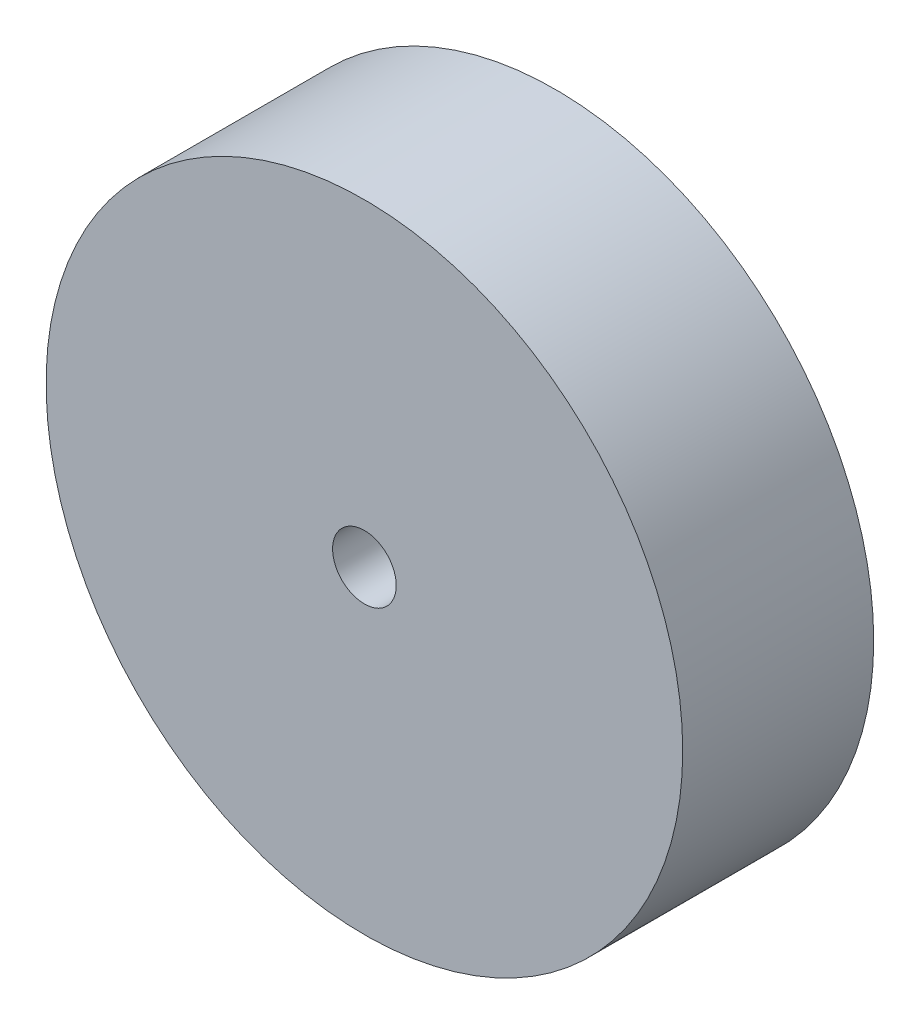
ISO-10303-21;
HEADER;
FILE_DESCRIPTION(('STEP AP214'),'2;1');
FILE_NAME('part.step','',(''),(''),'','','');
FILE_SCHEMA(('AUTOMOTIVE_DESIGN { 1 0 10303 214 1 1 1 1 }'));
ENDSEC;
DATA;
#1=APPLICATION_CONTEXT('core data for automotive mechanical design processes');
#2=APPLICATION_PROTOCOL_DEFINITION('international standard','automotive_design',2000,#1);
#3=PRODUCT_CONTEXT('',#1,'mechanical');
#4=PRODUCT('Part','Part','',(#3));
#5=PRODUCT_RELATED_PRODUCT_CATEGORY('part','',(#4));
#6=PRODUCT_DEFINITION_FORMATION('','',#4);
#7=PRODUCT_DEFINITION_CONTEXT('part definition',#1,'design');
#8=PRODUCT_DEFINITION('design','',#6,#7);
#9=PRODUCT_DEFINITION_SHAPE('','',#8);
#10=(LENGTH_UNIT() NAMED_UNIT(*) SI_UNIT(.MILLI.,.METRE.));
#11=(NAMED_UNIT(*) PLANE_ANGLE_UNIT() SI_UNIT($,.RADIAN.));
#12=(NAMED_UNIT(*) SI_UNIT($,.STERADIAN.) SOLID_ANGLE_UNIT());
#13=UNCERTAINTY_MEASURE_WITH_UNIT(LENGTH_MEASURE(1.E-05),#10,'distance_accuracy_value','');
#14=(GEOMETRIC_REPRESENTATION_CONTEXT(3) GLOBAL_UNCERTAINTY_ASSIGNED_CONTEXT((#13)) GLOBAL_UNIT_ASSIGNED_CONTEXT((#10,
#11,#12)) REPRESENTATION_CONTEXT('',''));
#15=CARTESIAN_POINT('',(0.,0.,0.));
#16=DIRECTION('',(0.,0.,1.));
#17=DIRECTION('',(1.,0.,0.));
#18=AXIS2_PLACEMENT_3D('',#15,#16,#17);
#19=CARTESIAN_POINT('',(0.,0.,15.));
#20=DIRECTION('',(0.,0.,1.));
#21=DIRECTION('',(1.,0.,0.));
#22=AXIS2_PLACEMENT_3D('',#19,#20,#21);
#23=PLANE('',#22);
#24=CARTESIAN_POINT('',(0.,0.,15.));
#25=DIRECTION('',(0.,0.,1.));
#26=DIRECTION('',(1.,0.,0.));
#27=AXIS2_PLACEMENT_3D('',#24,#25,#26);
#28=CIRCLE('',#27,25.);
#29=CARTESIAN_POINT('',(25.,0.,15.));
#30=VERTEX_POINT('',#29);
#31=EDGE_CURVE('E10',#30,#30,#28,.T.);
#32=ORIENTED_EDGE('',*,*,#31,.T.);
#33=EDGE_LOOP('',(#32));
#34=FACE_BOUND('',#33,.T.);
#35=CARTESIAN_POINT('',(0.,0.,15.));
#36=DIRECTION('',(0.,0.,1.));
#37=DIRECTION('',(1.,0.,0.));
#38=AXIS2_PLACEMENT_3D('',#35,#36,#37);
#39=CIRCLE('',#38,2.5);
#40=CARTESIAN_POINT('',(2.5,0.,15.));
#41=VERTEX_POINT('',#40);
#42=EDGE_CURVE('E50',#41,#41,#39,.T.);
#43=ORIENTED_EDGE('',*,*,#42,.F.);
#44=EDGE_LOOP('',(#43));
#45=FACE_BOUND('',#44,.T.);
#46=ADVANCED_FACE('F37',(#34,#45),#23,.T.);
#47=CARTESIAN_POINT('',(0.,0.,0.));
#48=DIRECTION('',(0.,0.,1.));
#49=DIRECTION('',(1.,0.,0.));
#50=AXIS2_PLACEMENT_3D('',#47,#48,#49);
#51=PLANE('',#50);
#52=CARTESIAN_POINT('',(0.,0.,0.));
#53=DIRECTION('',(0.,0.,1.));
#54=DIRECTION('',(1.,0.,0.));
#55=AXIS2_PLACEMENT_3D('',#52,#53,#54);
#56=CIRCLE('',#55,25.);
#57=CARTESIAN_POINT('',(25.,0.,0.));
#58=VERTEX_POINT('',#57);
#59=EDGE_CURVE('E41',#58,#58,#56,.T.);
#60=ORIENTED_EDGE('',*,*,#59,.F.);
#61=EDGE_LOOP('',(#60));
#62=FACE_BOUND('',#61,.T.);
#63=CARTESIAN_POINT('',(0.,0.,0.));
#64=DIRECTION('',(0.,0.,1.));
#65=DIRECTION('',(1.,0.,0.));
#66=AXIS2_PLACEMENT_3D('',#63,#64,#65);
#67=CIRCLE('',#66,2.5);
#68=CARTESIAN_POINT('',(2.5,0.,0.));
#69=VERTEX_POINT('',#68);
#70=EDGE_CURVE('E52',#69,#69,#67,.T.);
#71=ORIENTED_EDGE('',*,*,#70,.T.);
#72=EDGE_LOOP('',(#71));
#73=FACE_BOUND('',#72,.T.);
#74=ADVANCED_FACE('F64',(#62,#73),#51,.F.);
#75=CARTESIAN_POINT('',(0.,0.,15.));
#76=DIRECTION('',(0.,0.,-1.));
#77=DIRECTION('',(-1.,0.,0.));
#78=AXIS2_PLACEMENT_3D('',#75,#76,#77);
#79=CYLINDRICAL_SURFACE('',#78,25.);
#80=ORIENTED_EDGE('',*,*,#31,.F.);
#81=EDGE_LOOP('',(#80));
#82=FACE_BOUND('',#81,.T.);
#83=ORIENTED_EDGE('',*,*,#59,.T.);
#84=EDGE_LOOP('',(#83));
#85=FACE_BOUND('',#84,.T.);
#86=ADVANCED_FACE('F39',(#82,#85),#79,.T.);
#87=CARTESIAN_POINT('',(0.,0.,15.));
#88=DIRECTION('',(0.,0.,-1.));
#89=DIRECTION('',(-1.,0.,0.));
#90=AXIS2_PLACEMENT_3D('',#87,#88,#89);
#91=CYLINDRICAL_SURFACE('',#90,2.5);
#92=ORIENTED_EDGE('',*,*,#42,.T.);
#93=EDGE_LOOP('',(#92));
#94=FACE_BOUND('',#93,.T.);
#95=ORIENTED_EDGE('',*,*,#70,.F.);
#96=EDGE_LOOP('',(#95));
#97=FACE_BOUND('',#96,.T.);
#98=ADVANCED_FACE('F60',(#94,#97),#91,.F.);
#99=CLOSED_SHELL('',(#46,#74,#86,#98));
#100=MANIFOLD_SOLID_BREP('B2',#99);
#101=ADVANCED_BREP_SHAPE_REPRESENTATION('',(#18,#100),#14);
#102=SHAPE_DEFINITION_REPRESENTATION(#9,#101);
ENDSEC;
END-ISO-10303-21;
